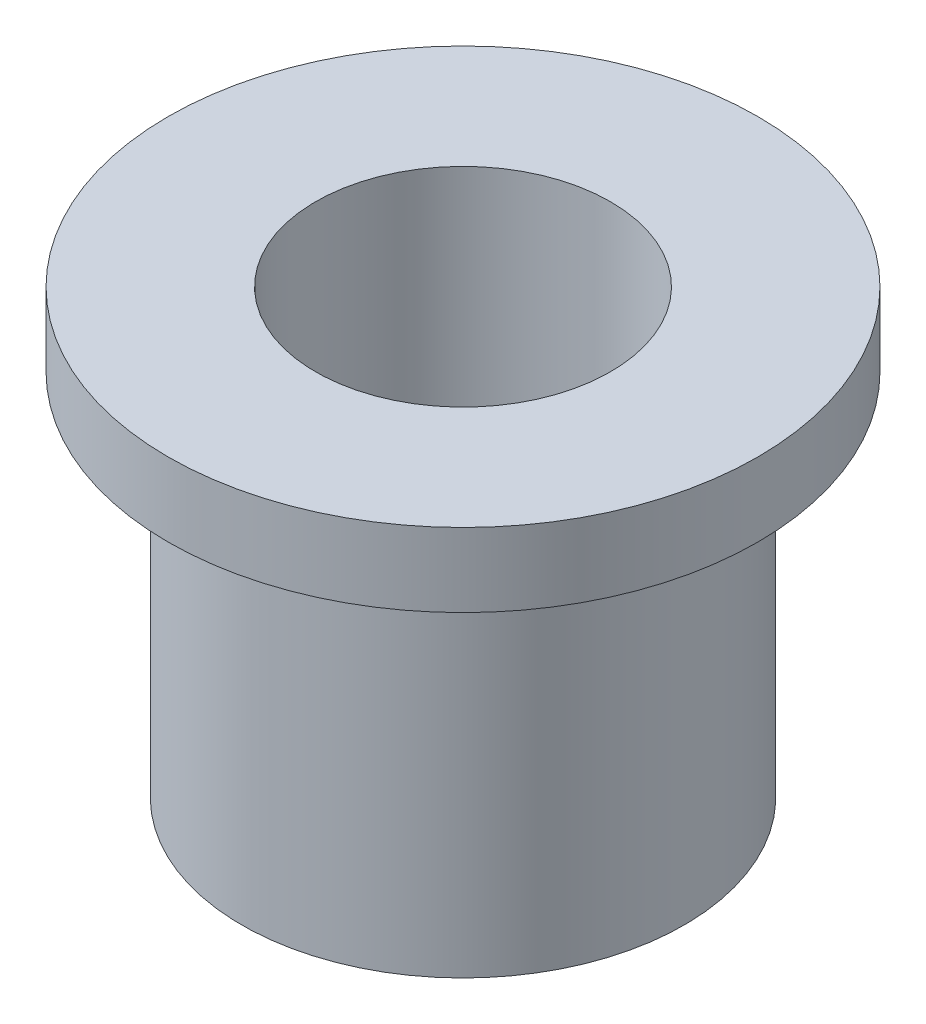
ISO-10303-21;
HEADER;
FILE_DESCRIPTION(('STEP AP214'),'2;1');
FILE_NAME('part.step','',(''),(''),'','','');
FILE_SCHEMA(('AUTOMOTIVE_DESIGN { 1 0 10303 214 1 1 1 1 }'));
ENDSEC;
DATA;
#1=APPLICATION_CONTEXT('core data for automotive mechanical design processes');
#2=APPLICATION_PROTOCOL_DEFINITION('international standard','automotive_design',2000,#1);
#3=PRODUCT_CONTEXT('',#1,'mechanical');
#4=PRODUCT('Part','Part','',(#3));
#5=PRODUCT_RELATED_PRODUCT_CATEGORY('part','',(#4));
#6=PRODUCT_DEFINITION_FORMATION('','',#4);
#7=PRODUCT_DEFINITION_CONTEXT('part definition',#1,'design');
#8=PRODUCT_DEFINITION('design','',#6,#7);
#9=PRODUCT_DEFINITION_SHAPE('','',#8);
#10=(LENGTH_UNIT() NAMED_UNIT(*) SI_UNIT(.MILLI.,.METRE.));
#11=(NAMED_UNIT(*) PLANE_ANGLE_UNIT() SI_UNIT($,.RADIAN.));
#12=(NAMED_UNIT(*) SI_UNIT($,.STERADIAN.) SOLID_ANGLE_UNIT());
#13=UNCERTAINTY_MEASURE_WITH_UNIT(LENGTH_MEASURE(1.E-05),#10,'distance_accuracy_value','');
#14=(GEOMETRIC_REPRESENTATION_CONTEXT(3) GLOBAL_UNCERTAINTY_ASSIGNED_CONTEXT((#13)) GLOBAL_UNIT_ASSIGNED_CONTEXT((#10,
#11,#12)) REPRESENTATION_CONTEXT('',''));
#15=CARTESIAN_POINT('',(0.,0.,0.));
#16=DIRECTION('',(0.,0.,1.));
#17=DIRECTION('',(1.,0.,0.));
#18=AXIS2_PLACEMENT_3D('',#15,#16,#17);
#19=CARTESIAN_POINT('',(0.,9.525,0.));
#20=DIRECTION('',(0.,-1.,0.));
#21=DIRECTION('',(0.,0.,-1.));
#22=AXIS2_PLACEMENT_3D('',#19,#20,#21);
#23=CYLINDRICAL_SURFACE('',#22,4.7625);
#24=CARTESIAN_POINT('',(0.,0.,0.));
#25=DIRECTION('',(0.,1.,0.));
#26=DIRECTION('',(0.,0.,1.));
#27=AXIS2_PLACEMENT_3D('',#24,#25,#26);
#28=CIRCLE('',#27,4.7625);
#29=CARTESIAN_POINT('',(0.,0.,-4.7625));
#30=VERTEX_POINT('',#29);
#31=EDGE_CURVE('E34',#30,#30,#28,.T.);
#32=CARTESIAN_POINT('',(0.,7.9375,0.));
#33=DIRECTION('',(0.,1.,0.));
#34=DIRECTION('',(0.,0.,1.));
#35=AXIS2_PLACEMENT_3D('',#32,#33,#34);
#36=CIRCLE('',#35,4.7625);
#37=CARTESIAN_POINT('',(0.,7.9375,-4.7625));
#38=VERTEX_POINT('',#37);
#39=EDGE_CURVE('E10',#38,#38,#36,.T.);
#40=CARTESIAN_POINT('',(0.,0.,-4.7625));
#41=CARTESIAN_POINT('',(0.,0.0826822916666665,-4.7625));
#42=CARTESIAN_POINT('',(0.,0.165364583333333,-4.7625));
#43=CARTESIAN_POINT('',(0.,0.330729166666666,-4.7625));
#44=CARTESIAN_POINT('',(0.,0.413411458333333,-4.7625));
#45=CARTESIAN_POINT('',(0.,0.578776041666666,-4.7625));
#46=CARTESIAN_POINT('',(0.,0.661458333333333,-4.7625));
#47=CARTESIAN_POINT('',(0.,0.826822916666667,-4.7625));
#48=CARTESIAN_POINT('',(0.,0.909505208333333,-4.7625));
#49=CARTESIAN_POINT('',(0.,1.07486979166667,-4.7625));
#50=CARTESIAN_POINT('',(0.,1.15755208333333,-4.7625));
#51=CARTESIAN_POINT('',(0.,1.32291666666667,-4.7625));
#52=CARTESIAN_POINT('',(0.,1.40559895833333,-4.7625));
#53=CARTESIAN_POINT('',(0.,1.57096354166667,-4.7625));
#54=CARTESIAN_POINT('',(0.,1.65364583333333,-4.7625));
#55=CARTESIAN_POINT('',(0.,1.81901041666667,-4.7625));
#56=CARTESIAN_POINT('',(0.,1.90169270833333,-4.7625));
#57=CARTESIAN_POINT('',(0.,2.06705729166667,-4.7625));
#58=CARTESIAN_POINT('',(0.,2.14973958333333,-4.7625));
#59=CARTESIAN_POINT('',(0.,2.31510416666667,-4.7625));
#60=CARTESIAN_POINT('',(0.,2.39778645833333,-4.7625));
#61=CARTESIAN_POINT('',(0.,2.56315104166667,-4.7625));
#62=CARTESIAN_POINT('',(0.,2.64583333333333,-4.7625));
#63=CARTESIAN_POINT('',(0.,2.81119791666667,-4.7625));
#64=CARTESIAN_POINT('',(0.,2.89388020833333,-4.7625));
#65=CARTESIAN_POINT('',(0.,3.05924479166667,-4.7625));
#66=CARTESIAN_POINT('',(0.,3.14192708333333,-4.7625));
#67=CARTESIAN_POINT('',(0.,3.30729166666667,-4.7625));
#68=CARTESIAN_POINT('',(0.,3.38997395833333,-4.7625));
#69=CARTESIAN_POINT('',(0.,3.55533854166667,-4.7625));
#70=CARTESIAN_POINT('',(0.,3.63802083333333,-4.7625));
#71=CARTESIAN_POINT('',(0.,3.80338541666667,-4.7625));
#72=CARTESIAN_POINT('',(0.,3.88606770833333,-4.7625));
#73=CARTESIAN_POINT('',(0.,4.05143229166667,-4.7625));
#74=CARTESIAN_POINT('',(0.,4.13411458333333,-4.7625));
#75=CARTESIAN_POINT('',(0.,4.29947916666667,-4.7625));
#76=CARTESIAN_POINT('',(0.,4.38216145833333,-4.7625));
#77=CARTESIAN_POINT('',(0.,4.54752604166667,-4.7625));
#78=CARTESIAN_POINT('',(0.,4.63020833333333,-4.7625));
#79=CARTESIAN_POINT('',(0.,4.79557291666667,-4.7625));
#80=CARTESIAN_POINT('',(0.,4.87825520833333,-4.7625));
#81=CARTESIAN_POINT('',(0.,5.04361979166667,-4.7625));
#82=CARTESIAN_POINT('',(0.,5.12630208333333,-4.7625));
#83=CARTESIAN_POINT('',(0.,5.29166666666667,-4.7625));
#84=CARTESIAN_POINT('',(0.,5.37434895833333,-4.7625));
#85=CARTESIAN_POINT('',(0.,5.53971354166667,-4.7625));
#86=CARTESIAN_POINT('',(0.,5.62239583333333,-4.7625));
#87=CARTESIAN_POINT('',(0.,5.78776041666667,-4.7625));
#88=CARTESIAN_POINT('',(0.,5.87044270833333,-4.7625));
#89=CARTESIAN_POINT('',(0.,6.03580729166666,-4.7625));
#90=CARTESIAN_POINT('',(0.,6.11848958333333,-4.7625));
#91=CARTESIAN_POINT('',(0.,6.28385416666667,-4.7625));
#92=CARTESIAN_POINT('',(0.,6.36653645833333,-4.7625));
#93=CARTESIAN_POINT('',(0.,6.53190104166667,-4.7625));
#94=CARTESIAN_POINT('',(0.,6.61458333333333,-4.7625));
#95=CARTESIAN_POINT('',(0.,6.77994791666667,-4.7625));
#96=CARTESIAN_POINT('',(0.,6.86263020833333,-4.7625));
#97=CARTESIAN_POINT('',(0.,7.02799479166666,-4.7625));
#98=CARTESIAN_POINT('',(0.,7.11067708333333,-4.7625));
#99=CARTESIAN_POINT('',(0.,7.27604166666667,-4.7625));
#100=CARTESIAN_POINT('',(0.,7.35872395833333,-4.7625));
#101=CARTESIAN_POINT('',(0.,7.52408854166667,-4.7625));
#102=CARTESIAN_POINT('',(0.,7.60677083333333,-4.7625));
#103=CARTESIAN_POINT('',(0.,7.77213541666667,-4.7625));
#104=CARTESIAN_POINT('',(0.,7.85481770833333,-4.7625));
#105=CARTESIAN_POINT('',(0.,7.9375,-4.7625));
#106=B_SPLINE_CURVE_WITH_KNOTS('',3,(#40,#41,#42,#43,#44,#45,#46,#47,#48,#49,#50,#51,#52,#53,
#54,#55,#56,#57,#58,#59,#60,#61,#62,#63,#64,#65,#66,#67,#68,#69,#70,#71,#72,#73,#74,#75,#76,#77,
#78,#79,#80,#81,#82,#83,#84,#85,#86,#87,#88,#89,#90,#91,#92,#93,#94,#95,#96,#97,#98,#99,#100,
#101,#102,#103,#104,#105),.UNSPECIFIED.,.F.,.F.,(4,2,2,2,2,2,2,2,2,2,2,2,2,2,2,2,2,2,2,2,2,2,2,
2,2,2,2,2,2,2,2,2,4),(0.,0.248046875,0.496093749999999,0.744140625,0.9921875,1.240234375,
1.48828125,1.736328125,1.984375,2.232421875,2.48046875,2.728515625,2.9765625,3.224609375,
3.47265625,3.720703125,3.96875,4.216796875,4.46484375,4.712890625,4.9609375,5.208984375,
5.45703125,5.705078125,5.953125,6.201171875,6.44921875,6.697265625,6.9453125,7.193359375,
7.44140625,7.689453125,7.9375),.UNSPECIFIED.);
#107=EDGE_CURVE('BSEAM31',#30,#38,#106,.T.);
#108=ORIENTED_EDGE('',*,*,#31,.T.);
#109=ORIENTED_EDGE('',*,*,#39,.F.);
#110=ORIENTED_EDGE('',*,*,#107,.T.);
#111=ORIENTED_EDGE('',*,*,#107,.F.);
#112=EDGE_LOOP('',(#108,#110,#109,#111));
#113=FACE_BOUND('',#112,.T.);
#114=ADVANCED_FACE('F31',(#113),#23,.T.);
#115=CARTESIAN_POINT('',(0.,9.525,0.));
#116=DIRECTION('',(0.,1.,0.));
#117=DIRECTION('',(0.,0.,1.));
#118=AXIS2_PLACEMENT_3D('',#115,#116,#117);
#119=PLANE('',#118);
#120=CARTESIAN_POINT('',(0.,9.525,0.));
#121=DIRECTION('',(0.,1.,0.));
#122=DIRECTION('',(0.,0.,1.));
#123=AXIS2_PLACEMENT_3D('',#120,#121,#122);
#124=CIRCLE('',#123,3.175);
#125=CARTESIAN_POINT('',(0.,9.525,-3.175));
#126=VERTEX_POINT('',#125);
#127=EDGE_CURVE('E42',#126,#126,#124,.T.);
#128=ORIENTED_EDGE('',*,*,#127,.F.);
#129=EDGE_LOOP('',(#128));
#130=FACE_BOUND('',#129,.T.);
#131=CARTESIAN_POINT('',(0.,9.525,0.));
#132=DIRECTION('',(0.,1.,0.));
#133=DIRECTION('',(0.,0.,1.));
#134=AXIS2_PLACEMENT_3D('',#131,#132,#133);
#135=CIRCLE('',#134,6.35);
#136=CARTESIAN_POINT('',(0.,9.525,6.35));
#137=VERTEX_POINT('',#136);
#138=EDGE_CURVE('E45',#137,#137,#135,.T.);
#139=ORIENTED_EDGE('',*,*,#138,.T.);
#140=EDGE_LOOP('',(#139));
#141=FACE_BOUND('',#140,.T.);
#142=ADVANCED_FACE('F59',(#130,#141),#119,.T.);
#143=CARTESIAN_POINT('',(0.,0.,0.));
#144=DIRECTION('',(0.,1.,0.));
#145=DIRECTION('',(0.,0.,1.));
#146=AXIS2_PLACEMENT_3D('',#143,#144,#145);
#147=PLANE('',#146);
#148=ORIENTED_EDGE('',*,*,#31,.F.);
#149=EDGE_LOOP('',(#148));
#150=FACE_BOUND('',#149,.T.);
#151=CARTESIAN_POINT('',(0.,0.,0.));
#152=DIRECTION('',(0.,1.,0.));
#153=DIRECTION('',(0.,0.,1.));
#154=AXIS2_PLACEMENT_3D('',#151,#152,#153);
#155=CIRCLE('',#154,3.175);
#156=CARTESIAN_POINT('',(0.,0.,-3.175));
#157=VERTEX_POINT('',#156);
#158=EDGE_CURVE('E48',#157,#157,#155,.T.);
#159=ORIENTED_EDGE('',*,*,#158,.T.);
#160=EDGE_LOOP('',(#159));
#161=FACE_BOUND('',#160,.T.);
#162=ADVANCED_FACE('F77',(#150,#161),#147,.F.);
#163=CARTESIAN_POINT('',(0.,9.525,0.));
#164=DIRECTION('',(0.,-1.,0.));
#165=DIRECTION('',(0.,0.,-1.));
#166=AXIS2_PLACEMENT_3D('',#163,#164,#165);
#167=CYLINDRICAL_SURFACE('',#166,3.175);
#168=CARTESIAN_POINT('',(0.,9.525,-3.175));
#169=CARTESIAN_POINT('',(0.,9.42578125,-3.175));
#170=CARTESIAN_POINT('',(0.,9.3265625,-3.175));
#171=CARTESIAN_POINT('',(0.,9.128125,-3.175));
#172=CARTESIAN_POINT('',(0.,9.02890625,-3.175));
#173=CARTESIAN_POINT('',(0.,8.83046875,-3.175));
#174=CARTESIAN_POINT('',(0.,8.73125,-3.175));
#175=CARTESIAN_POINT('',(0.,8.5328125,-3.175));
#176=CARTESIAN_POINT('',(0.,8.43359375,-3.175));
#177=CARTESIAN_POINT('',(0.,8.23515625,-3.175));
#178=CARTESIAN_POINT('',(0.,8.1359375,-3.175));
#179=CARTESIAN_POINT('',(0.,7.9375,-3.175));
#180=CARTESIAN_POINT('',(0.,7.83828125,-3.175));
#181=CARTESIAN_POINT('',(0.,7.63984375,-3.175));
#182=CARTESIAN_POINT('',(0.,7.540625,-3.175));
#183=CARTESIAN_POINT('',(0.,7.3421875,-3.175));
#184=CARTESIAN_POINT('',(0.,7.24296875,-3.175));
#185=CARTESIAN_POINT('',(0.,7.04453125,-3.175));
#186=CARTESIAN_POINT('',(0.,6.9453125,-3.175));
#187=CARTESIAN_POINT('',(0.,6.746875,-3.175));
#188=CARTESIAN_POINT('',(0.,6.64765625,-3.175));
#189=CARTESIAN_POINT('',(0.,6.44921875,-3.175));
#190=CARTESIAN_POINT('',(0.,6.35,-3.175));
#191=CARTESIAN_POINT('',(0.,6.1515625,-3.175));
#192=CARTESIAN_POINT('',(0.,6.05234375,-3.175));
#193=CARTESIAN_POINT('',(0.,5.85390625,-3.175));
#194=CARTESIAN_POINT('',(0.,5.7546875,-3.175));
#195=CARTESIAN_POINT('',(0.,5.55625,-3.175));
#196=CARTESIAN_POINT('',(0.,5.45703125,-3.175));
#197=CARTESIAN_POINT('',(0.,5.25859375,-3.175));
#198=CARTESIAN_POINT('',(0.,5.159375,-3.175));
#199=CARTESIAN_POINT('',(0.,4.9609375,-3.175));
#200=CARTESIAN_POINT('',(0.,4.86171875,-3.175));
#201=CARTESIAN_POINT('',(0.,4.66328125,-3.175));
#202=CARTESIAN_POINT('',(0.,4.5640625,-3.175));
#203=CARTESIAN_POINT('',(0.,4.365625,-3.175));
#204=CARTESIAN_POINT('',(0.,4.26640625,-3.175));
#205=CARTESIAN_POINT('',(0.,4.06796875,-3.175));
#206=CARTESIAN_POINT('',(0.,3.96875,-3.175));
#207=CARTESIAN_POINT('',(0.,3.7703125,-3.175));
#208=CARTESIAN_POINT('',(0.,3.67109375,-3.175));
#209=CARTESIAN_POINT('',(0.,3.47265625,-3.175));
#210=CARTESIAN_POINT('',(0.,3.3734375,-3.175));
#211=CARTESIAN_POINT('',(0.,3.175,-3.175));
#212=CARTESIAN_POINT('',(0.,3.07578125,-3.175));
#213=CARTESIAN_POINT('',(0.,2.87734375,-3.175));
#214=CARTESIAN_POINT('',(0.,2.778125,-3.175));
#215=CARTESIAN_POINT('',(0.,2.5796875,-3.175));
#216=CARTESIAN_POINT('',(0.,2.48046875,-3.175));
#217=CARTESIAN_POINT('',(0.,2.28203125,-3.175));
#218=CARTESIAN_POINT('',(0.,2.1828125,-3.175));
#219=CARTESIAN_POINT('',(0.,1.984375,-3.175));
#220=CARTESIAN_POINT('',(0.,1.88515625,-3.175));
#221=CARTESIAN_POINT('',(0.,1.68671875,-3.175));
#222=CARTESIAN_POINT('',(0.,1.5875,-3.175));
#223=CARTESIAN_POINT('',(0.,1.3890625,-3.175));
#224=CARTESIAN_POINT('',(0.,1.28984375,-3.175));
#225=CARTESIAN_POINT('',(0.,1.09140625,-3.175));
#226=CARTESIAN_POINT('',(0.,0.992187500000001,-3.175));
#227=CARTESIAN_POINT('',(0.,0.793750000000001,-3.175));
#228=CARTESIAN_POINT('',(0.,0.69453125,-3.175));
#229=CARTESIAN_POINT('',(0.,0.49609375,-3.175));
#230=CARTESIAN_POINT('',(0.,0.396875,-3.175));
#231=CARTESIAN_POINT('',(0.,0.1984375,-3.175));
#232=CARTESIAN_POINT('',(0.,0.0992187500000001,-3.175));
#233=CARTESIAN_POINT('',(0.,0.,-3.175));
#234=B_SPLINE_CURVE_WITH_KNOTS('',3,(#168,#169,#170,#171,#172,#173,#174,#175,#176,#177,#178,
#179,#180,#181,#182,#183,#184,#185,#186,#187,#188,#189,#190,#191,#192,#193,#194,#195,#196,#197,
#198,#199,#200,#201,#202,#203,#204,#205,#206,#207,#208,#209,#210,#211,#212,#213,#214,#215,#216,
#217,#218,#219,#220,#221,#222,#223,#224,#225,#226,#227,#228,#229,#230,#231,#232,#233),
.UNSPECIFIED.,.F.,.F.,(4,2,2,2,2,2,2,2,2,2,2,2,2,2,2,2,2,2,2,2,2,2,2,2,2,2,2,2,2,2,2,2,4),(0.,
0.29765625,0.5953125,0.892968750000001,1.190625,1.48828125,1.7859375,2.08359375,2.38125,
2.67890625,2.9765625,3.27421875,3.571875,3.86953125,4.1671875,4.46484375,4.7625,5.06015625,
5.3578125,5.65546875,5.953125,6.25078125,6.5484375,6.84609375,7.14375,7.44140625,7.7390625,
8.03671875,8.334375,8.63203125,8.9296875,9.22734375,9.525),.UNSPECIFIED.);
#235=EDGE_CURVE('BSEAM68',#126,#157,#234,.T.);
#236=ORIENTED_EDGE('',*,*,#127,.T.);
#237=ORIENTED_EDGE('',*,*,#158,.F.);
#238=ORIENTED_EDGE('',*,*,#235,.T.);
#239=ORIENTED_EDGE('',*,*,#235,.F.);
#240=EDGE_LOOP('',(#236,#238,#237,#239));
#241=FACE_BOUND('',#240,.T.);
#242=ADVANCED_FACE('F68',(#241),#167,.F.);
#243=CARTESIAN_POINT('',(0.,7.9375,0.));
#244=DIRECTION('',(0.,1.,0.));
#245=DIRECTION('',(0.,0.,1.));
#246=AXIS2_PLACEMENT_3D('',#243,#244,#245);
#247=PLANE('',#246);
#248=CARTESIAN_POINT('',(0.,7.9375,0.));
#249=DIRECTION('',(0.,1.,0.));
#250=DIRECTION('',(0.,0.,1.));
#251=AXIS2_PLACEMENT_3D('',#248,#249,#250);
#252=CIRCLE('',#251,6.35);
#253=CARTESIAN_POINT('',(0.,7.9375,6.35));
#254=VERTEX_POINT('',#253);
#255=EDGE_CURVE('E50',#254,#254,#252,.T.);
#256=ORIENTED_EDGE('',*,*,#255,.F.);
#257=EDGE_LOOP('',(#256));
#258=FACE_BOUND('',#257,.T.);
#259=ORIENTED_EDGE('',*,*,#39,.T.);
#260=EDGE_LOOP('',(#259));
#261=FACE_BOUND('',#260,.T.);
#262=ADVANCED_FACE('F63',(#258,#261),#247,.F.);
#263=CARTESIAN_POINT('',(0.,7.9375,0.));
#264=DIRECTION('',(0.,1.,0.));
#265=DIRECTION('',(0.,0.,1.));
#266=AXIS2_PLACEMENT_3D('',#263,#264,#265);
#267=CYLINDRICAL_SURFACE('',#266,6.35);
#268=ORIENTED_EDGE('',*,*,#255,.T.);
#269=EDGE_LOOP('',(#268));
#270=FACE_BOUND('',#269,.T.);
#271=ORIENTED_EDGE('',*,*,#138,.F.);
#272=EDGE_LOOP('',(#271));
#273=FACE_BOUND('',#272,.T.);
#274=ADVANCED_FACE('F61',(#270,#273),#267,.T.);
#275=CLOSED_SHELL('',(#114,#142,#162,#242,#262,#274));
#276=MANIFOLD_SOLID_BREP('B2',#275);
#277=ADVANCED_BREP_SHAPE_REPRESENTATION('',(#18,#276),#14);
#278=SHAPE_DEFINITION_REPRESENTATION(#9,#277);
ENDSEC;
END-ISO-10303-21;
